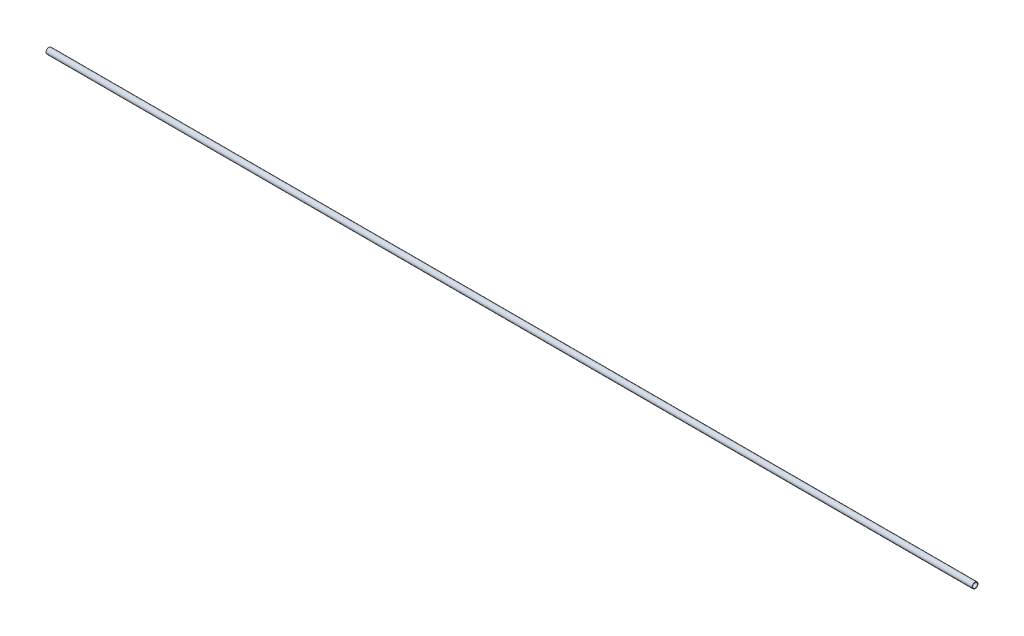
ISO-10303-21;
HEADER;
FILE_DESCRIPTION(('STEP AP214'),'2;1');
FILE_NAME('part.step','',(''),(''),'','','');
FILE_SCHEMA(('AUTOMOTIVE_DESIGN { 1 0 10303 214 1 1 1 1 }'));
ENDSEC;
DATA;
#1=APPLICATION_CONTEXT('core data for automotive mechanical design processes');
#2=APPLICATION_PROTOCOL_DEFINITION('international standard','automotive_design',2000,#1);
#3=PRODUCT_CONTEXT('',#1,'mechanical');
#4=PRODUCT('Part','Part','',(#3));
#5=PRODUCT_RELATED_PRODUCT_CATEGORY('part','',(#4));
#6=PRODUCT_DEFINITION_FORMATION('','',#4);
#7=PRODUCT_DEFINITION_CONTEXT('part definition',#1,'design');
#8=PRODUCT_DEFINITION('design','',#6,#7);
#9=PRODUCT_DEFINITION_SHAPE('','',#8);
#10=(LENGTH_UNIT() NAMED_UNIT(*) SI_UNIT(.MILLI.,.METRE.));
#11=(NAMED_UNIT(*) PLANE_ANGLE_UNIT() SI_UNIT($,.RADIAN.));
#12=(NAMED_UNIT(*) SI_UNIT($,.STERADIAN.) SOLID_ANGLE_UNIT());
#13=UNCERTAINTY_MEASURE_WITH_UNIT(LENGTH_MEASURE(1.E-05),#10,'distance_accuracy_value','');
#14=(GEOMETRIC_REPRESENTATION_CONTEXT(3) GLOBAL_UNCERTAINTY_ASSIGNED_CONTEXT((#13)) GLOBAL_UNIT_ASSIGNED_CONTEXT((#10,
#11,#12)) REPRESENTATION_CONTEXT('',''));
#15=CARTESIAN_POINT('',(0.,0.,0.));
#16=DIRECTION('',(0.,0.,1.));
#17=DIRECTION('',(1.,0.,0.));
#18=AXIS2_PLACEMENT_3D('',#15,#16,#17);
#19=CARTESIAN_POINT('',(1219.2,0.,0.));
#20=DIRECTION('',(-1.,0.,0.));
#21=DIRECTION('',(0.,0.,1.));
#22=AXIS2_PLACEMENT_3D('',#19,#20,#21);
#23=CYLINDRICAL_SURFACE('',#22,3.81);
#24=CARTESIAN_POINT('',(1219.2,0.,0.));
#25=DIRECTION('',(1.,0.,0.));
#26=DIRECTION('',(0.,0.,-1.));
#27=AXIS2_PLACEMENT_3D('',#24,#25,#26);
#28=CIRCLE('',#27,3.81);
#29=CARTESIAN_POINT('',(1219.2,0.,3.81));
#30=VERTEX_POINT('',#29);
#31=EDGE_CURVE('E10',#30,#30,#28,.T.);
#32=CARTESIAN_POINT('',(0.,0.,0.));
#33=DIRECTION('',(1.,0.,0.));
#34=DIRECTION('',(0.,0.,-1.));
#35=AXIS2_PLACEMENT_3D('',#32,#33,#34);
#36=CIRCLE('',#35,3.81);
#37=CARTESIAN_POINT('',(0.,0.,3.81));
#38=VERTEX_POINT('',#37);
#39=EDGE_CURVE('E35',#38,#38,#36,.T.);
#40=CARTESIAN_POINT('',(1219.2,0.,3.81));
#41=CARTESIAN_POINT('',(1206.5,0.,3.81));
#42=CARTESIAN_POINT('',(1193.8,0.,3.81));
#43=CARTESIAN_POINT('',(1168.4,0.,3.81));
#44=CARTESIAN_POINT('',(1155.7,0.,3.81));
#45=CARTESIAN_POINT('',(1130.3,0.,3.81));
#46=CARTESIAN_POINT('',(1117.6,0.,3.81));
#47=CARTESIAN_POINT('',(1092.2,0.,3.81));
#48=CARTESIAN_POINT('',(1079.5,0.,3.81));
#49=CARTESIAN_POINT('',(1054.1,0.,3.81));
#50=CARTESIAN_POINT('',(1041.4,0.,3.81));
#51=CARTESIAN_POINT('',(1016.,0.,3.81));
#52=CARTESIAN_POINT('',(1003.3,0.,3.81));
#53=CARTESIAN_POINT('',(977.9,0.,3.81));
#54=CARTESIAN_POINT('',(965.2,0.,3.81));
#55=CARTESIAN_POINT('',(939.8,0.,3.81));
#56=CARTESIAN_POINT('',(927.1,0.,3.81));
#57=CARTESIAN_POINT('',(901.7,0.,3.81));
#58=CARTESIAN_POINT('',(889.,0.,3.81));
#59=CARTESIAN_POINT('',(863.6,0.,3.81));
#60=CARTESIAN_POINT('',(850.9,0.,3.81));
#61=CARTESIAN_POINT('',(825.5,0.,3.81));
#62=CARTESIAN_POINT('',(812.8,0.,3.81));
#63=CARTESIAN_POINT('',(787.4,0.,3.81));
#64=CARTESIAN_POINT('',(774.7,0.,3.81));
#65=CARTESIAN_POINT('',(749.3,0.,3.81));
#66=CARTESIAN_POINT('',(736.6,0.,3.81));
#67=CARTESIAN_POINT('',(711.2,0.,3.81));
#68=CARTESIAN_POINT('',(698.5,0.,3.81));
#69=CARTESIAN_POINT('',(673.1,0.,3.81));
#70=CARTESIAN_POINT('',(660.4,0.,3.81));
#71=CARTESIAN_POINT('',(635.,0.,3.81));
#72=CARTESIAN_POINT('',(622.3,0.,3.81));
#73=CARTESIAN_POINT('',(596.9,0.,3.81));
#74=CARTESIAN_POINT('',(584.2,0.,3.81));
#75=CARTESIAN_POINT('',(558.8,0.,3.81));
#76=CARTESIAN_POINT('',(546.1,0.,3.81));
#77=CARTESIAN_POINT('',(520.7,0.,3.81));
#78=CARTESIAN_POINT('',(508.,0.,3.81));
#79=CARTESIAN_POINT('',(482.6,0.,3.81));
#80=CARTESIAN_POINT('',(469.9,0.,3.81));
#81=CARTESIAN_POINT('',(444.5,0.,3.81));
#82=CARTESIAN_POINT('',(431.8,0.,3.81));
#83=CARTESIAN_POINT('',(406.4,0.,3.81));
#84=CARTESIAN_POINT('',(393.7,0.,3.81));
#85=CARTESIAN_POINT('',(368.3,0.,3.81));
#86=CARTESIAN_POINT('',(355.6,0.,3.81));
#87=CARTESIAN_POINT('',(330.2,0.,3.81));
#88=CARTESIAN_POINT('',(317.5,0.,3.81));
#89=CARTESIAN_POINT('',(292.1,0.,3.81));
#90=CARTESIAN_POINT('',(279.4,0.,3.81));
#91=CARTESIAN_POINT('',(254.,0.,3.81));
#92=CARTESIAN_POINT('',(241.3,0.,3.81));
#93=CARTESIAN_POINT('',(215.9,0.,3.81));
#94=CARTESIAN_POINT('',(203.2,0.,3.81));
#95=CARTESIAN_POINT('',(177.8,0.,3.81));
#96=CARTESIAN_POINT('',(165.1,0.,3.81));
#97=CARTESIAN_POINT('',(139.7,0.,3.81));
#98=CARTESIAN_POINT('',(127.,0.,3.81));
#99=CARTESIAN_POINT('',(101.6,0.,3.81));
#100=CARTESIAN_POINT('',(88.9,0.,3.81));
#101=CARTESIAN_POINT('',(63.5,0.,3.81));
#102=CARTESIAN_POINT('',(50.8,0.,3.81));
#103=CARTESIAN_POINT('',(25.4,0.,3.81));
#104=CARTESIAN_POINT('',(12.7,0.,3.81));
#105=CARTESIAN_POINT('',(0.,0.,3.81));
#106=B_SPLINE_CURVE_WITH_KNOTS('',3,(#40,#41,#42,#43,#44,#45,#46,#47,#48,#49,#50,#51,#52,#53,
#54,#55,#56,#57,#58,#59,#60,#61,#62,#63,#64,#65,#66,#67,#68,#69,#70,#71,#72,#73,#74,#75,#76,#77,
#78,#79,#80,#81,#82,#83,#84,#85,#86,#87,#88,#89,#90,#91,#92,#93,#94,#95,#96,#97,#98,#99,#100,
#101,#102,#103,#104,#105),.UNSPECIFIED.,.F.,.F.,(4,2,2,2,2,2,2,2,2,2,2,2,2,2,2,2,2,2,2,2,2,2,2,
2,2,2,2,2,2,2,2,2,4),(0.,38.0999999999998,76.1999999999998,114.3,152.4,190.5,228.6,266.7,304.8,
342.9,381.,419.1,457.2,495.3,533.4,571.5,609.6,647.7,685.8,723.9,762.,800.1,838.2,876.3,914.4,
952.5,990.6,1028.7,1066.8,1104.9,1143.,1181.1,1219.2),.UNSPECIFIED.);
#107=EDGE_CURVE('BSEAM32',#30,#38,#106,.T.);
#108=ORIENTED_EDGE('',*,*,#31,.F.);
#109=ORIENTED_EDGE('',*,*,#39,.T.);
#110=ORIENTED_EDGE('',*,*,#107,.T.);
#111=ORIENTED_EDGE('',*,*,#107,.F.);
#112=EDGE_LOOP('',(#108,#110,#109,#111));
#113=FACE_BOUND('',#112,.T.);
#114=ADVANCED_FACE('F32',(#113),#23,.T.);
#115=CARTESIAN_POINT('',(1219.2,0.,0.));
#116=DIRECTION('',(1.,0.,0.));
#117=DIRECTION('',(0.,0.,-1.));
#118=AXIS2_PLACEMENT_3D('',#115,#116,#117);
#119=PLANE('',#118);
#120=CARTESIAN_POINT('',(1219.2,0.,0.));
#121=DIRECTION('',(-1.,0.,0.));
#122=DIRECTION('',(0.,0.,1.));
#123=AXIS2_PLACEMENT_3D('',#120,#121,#122);
#124=CIRCLE('',#123,3.175);
#125=CARTESIAN_POINT('',(1219.2,0.,3.175));
#126=VERTEX_POINT('',#125);
#127=EDGE_CURVE('E42',#126,#126,#124,.T.);
#128=ORIENTED_EDGE('',*,*,#127,.T.);
#129=EDGE_LOOP('',(#128));
#130=FACE_BOUND('',#129,.T.);
#131=ORIENTED_EDGE('',*,*,#31,.T.);
#132=EDGE_LOOP('',(#131));
#133=FACE_BOUND('',#132,.T.);
#134=ADVANCED_FACE('F50',(#130,#133),#119,.T.);
#135=CARTESIAN_POINT('',(0.,0.,0.));
#136=DIRECTION('',(1.,0.,0.));
#137=DIRECTION('',(0.,0.,-1.));
#138=AXIS2_PLACEMENT_3D('',#135,#136,#137);
#139=PLANE('',#138);
#140=CARTESIAN_POINT('',(0.,0.,0.));
#141=DIRECTION('',(-1.,0.,0.));
#142=DIRECTION('',(0.,0.,1.));
#143=AXIS2_PLACEMENT_3D('',#140,#141,#142);
#144=CIRCLE('',#143,3.175);
#145=CARTESIAN_POINT('',(0.,0.,3.175));
#146=VERTEX_POINT('',#145);
#147=EDGE_CURVE('E44',#146,#146,#144,.T.);
#148=ORIENTED_EDGE('',*,*,#147,.F.);
#149=EDGE_LOOP('',(#148));
#150=FACE_BOUND('',#149,.T.);
#151=ORIENTED_EDGE('',*,*,#39,.F.);
#152=EDGE_LOOP('',(#151));
#153=FACE_BOUND('',#152,.T.);
#154=ADVANCED_FACE('F55',(#150,#153),#139,.F.);
#155=CARTESIAN_POINT('',(1219.2,0.,0.));
#156=DIRECTION('',(-1.,0.,0.));
#157=DIRECTION('',(0.,0.,1.));
#158=AXIS2_PLACEMENT_3D('',#155,#156,#157);
#159=CYLINDRICAL_SURFACE('',#158,3.175);
#160=CARTESIAN_POINT('',(1219.2,0.,3.175));
#161=CARTESIAN_POINT('',(1206.5,0.,3.175));
#162=CARTESIAN_POINT('',(1193.8,0.,3.175));
#163=CARTESIAN_POINT('',(1168.4,0.,3.175));
#164=CARTESIAN_POINT('',(1155.7,0.,3.175));
#165=CARTESIAN_POINT('',(1130.3,0.,3.175));
#166=CARTESIAN_POINT('',(1117.6,0.,3.175));
#167=CARTESIAN_POINT('',(1092.2,0.,3.175));
#168=CARTESIAN_POINT('',(1079.5,0.,3.175));
#169=CARTESIAN_POINT('',(1054.1,0.,3.175));
#170=CARTESIAN_POINT('',(1041.4,0.,3.175));
#171=CARTESIAN_POINT('',(1016.,0.,3.175));
#172=CARTESIAN_POINT('',(1003.3,0.,3.175));
#173=CARTESIAN_POINT('',(977.9,0.,3.175));
#174=CARTESIAN_POINT('',(965.2,0.,3.175));
#175=CARTESIAN_POINT('',(939.8,0.,3.175));
#176=CARTESIAN_POINT('',(927.1,0.,3.175));
#177=CARTESIAN_POINT('',(901.7,0.,3.175));
#178=CARTESIAN_POINT('',(889.,0.,3.175));
#179=CARTESIAN_POINT('',(863.6,0.,3.175));
#180=CARTESIAN_POINT('',(850.9,0.,3.175));
#181=CARTESIAN_POINT('',(825.5,0.,3.175));
#182=CARTESIAN_POINT('',(812.8,0.,3.175));
#183=CARTESIAN_POINT('',(787.4,0.,3.175));
#184=CARTESIAN_POINT('',(774.7,0.,3.175));
#185=CARTESIAN_POINT('',(749.3,0.,3.175));
#186=CARTESIAN_POINT('',(736.6,0.,3.175));
#187=CARTESIAN_POINT('',(711.2,0.,3.175));
#188=CARTESIAN_POINT('',(698.5,0.,3.175));
#189=CARTESIAN_POINT('',(673.1,0.,3.175));
#190=CARTESIAN_POINT('',(660.4,0.,3.175));
#191=CARTESIAN_POINT('',(635.,0.,3.175));
#192=CARTESIAN_POINT('',(622.3,0.,3.175));
#193=CARTESIAN_POINT('',(596.9,0.,3.175));
#194=CARTESIAN_POINT('',(584.2,0.,3.175));
#195=CARTESIAN_POINT('',(558.8,0.,3.175));
#196=CARTESIAN_POINT('',(546.1,0.,3.175));
#197=CARTESIAN_POINT('',(520.7,0.,3.175));
#198=CARTESIAN_POINT('',(508.,0.,3.175));
#199=CARTESIAN_POINT('',(482.6,0.,3.175));
#200=CARTESIAN_POINT('',(469.9,0.,3.175));
#201=CARTESIAN_POINT('',(444.5,0.,3.175));
#202=CARTESIAN_POINT('',(431.8,0.,3.175));
#203=CARTESIAN_POINT('',(406.4,0.,3.175));
#204=CARTESIAN_POINT('',(393.7,0.,3.175));
#205=CARTESIAN_POINT('',(368.3,0.,3.175));
#206=CARTESIAN_POINT('',(355.6,0.,3.175));
#207=CARTESIAN_POINT('',(330.2,0.,3.175));
#208=CARTESIAN_POINT('',(317.5,0.,3.175));
#209=CARTESIAN_POINT('',(292.1,0.,3.175));
#210=CARTESIAN_POINT('',(279.4,0.,3.175));
#211=CARTESIAN_POINT('',(254.,0.,3.175));
#212=CARTESIAN_POINT('',(241.3,0.,3.175));
#213=CARTESIAN_POINT('',(215.9,0.,3.175));
#214=CARTESIAN_POINT('',(203.2,0.,3.175));
#215=CARTESIAN_POINT('',(177.8,0.,3.175));
#216=CARTESIAN_POINT('',(165.1,0.,3.175));
#217=CARTESIAN_POINT('',(139.7,0.,3.175));
#218=CARTESIAN_POINT('',(127.,0.,3.175));
#219=CARTESIAN_POINT('',(101.6,0.,3.175));
#220=CARTESIAN_POINT('',(88.9,0.,3.175));
#221=CARTESIAN_POINT('',(63.5,0.,3.175));
#222=CARTESIAN_POINT('',(50.8,0.,3.175));
#223=CARTESIAN_POINT('',(25.4,0.,3.175));
#224=CARTESIAN_POINT('',(12.7,0.,3.175));
#225=CARTESIAN_POINT('',(0.,0.,3.175));
#226=B_SPLINE_CURVE_WITH_KNOTS('',3,(#160,#161,#162,#163,#164,#165,#166,#167,#168,#169,#170,
#171,#172,#173,#174,#175,#176,#177,#178,#179,#180,#181,#182,#183,#184,#185,#186,#187,#188,#189,
#190,#191,#192,#193,#194,#195,#196,#197,#198,#199,#200,#201,#202,#203,#204,#205,#206,#207,#208,
#209,#210,#211,#212,#213,#214,#215,#216,#217,#218,#219,#220,#221,#222,#223,#224,#225),
.UNSPECIFIED.,.F.,.F.,(4,2,2,2,2,2,2,2,2,2,2,2,2,2,2,2,2,2,2,2,2,2,2,2,2,2,2,2,2,2,2,2,4),(0.,
38.1,76.2,114.3,152.4,190.5,228.6,266.7,304.8,342.9,381.,419.1,457.2,495.3,533.4,571.5,609.6,
647.7,685.8,723.9,762.,800.1,838.2,876.3,914.4,952.5,990.6,1028.7,1066.8,1104.9,1143.,1181.1,
1219.2),.UNSPECIFIED.);
#227=EDGE_CURVE('BSEAM52',#126,#146,#226,.T.);
#228=ORIENTED_EDGE('',*,*,#127,.F.);
#229=ORIENTED_EDGE('',*,*,#147,.T.);
#230=ORIENTED_EDGE('',*,*,#227,.T.);
#231=ORIENTED_EDGE('',*,*,#227,.F.);
#232=EDGE_LOOP('',(#228,#230,#229,#231));
#233=FACE_BOUND('',#232,.T.);
#234=ADVANCED_FACE('F52',(#233),#159,.F.);
#235=CLOSED_SHELL('',(#114,#134,#154,#234));
#236=MANIFOLD_SOLID_BREP('B2',#235);
#237=ADVANCED_BREP_SHAPE_REPRESENTATION('',(#18,#236),#14);
#238=SHAPE_DEFINITION_REPRESENTATION(#9,#237);
ENDSEC;
END-ISO-10303-21;
